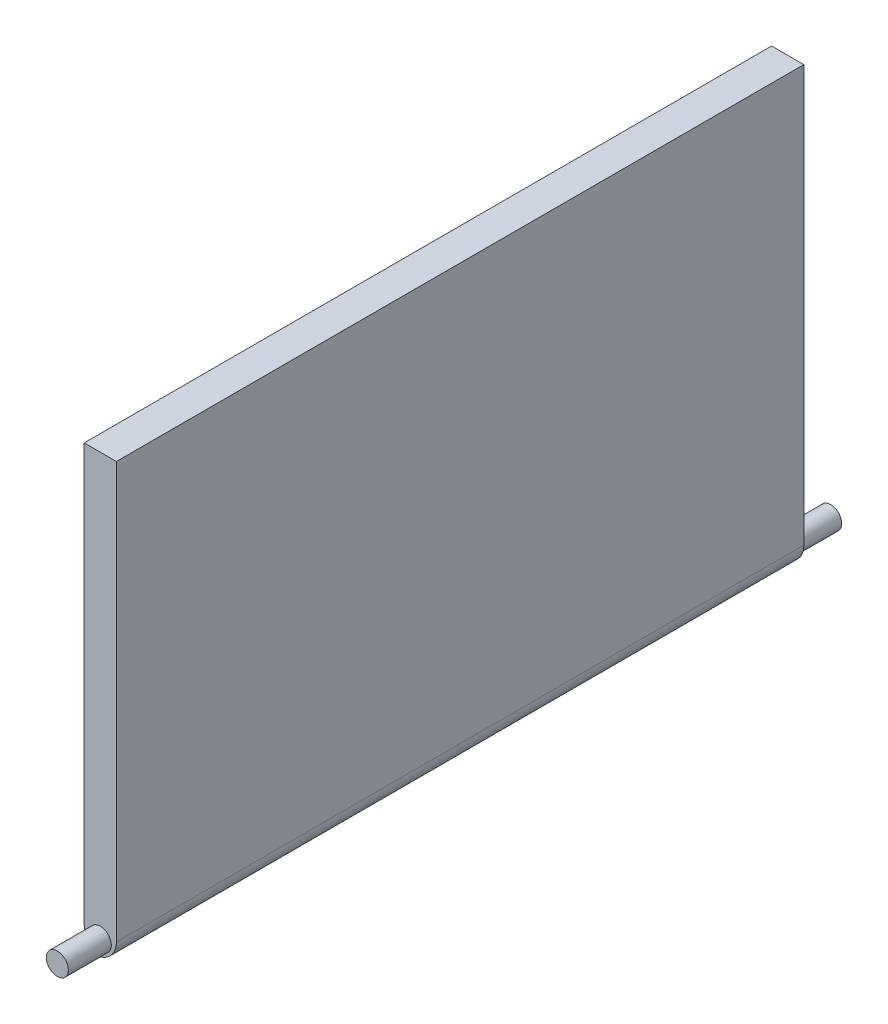
ISO-10303-21;
HEADER;
FILE_DESCRIPTION(('STEP AP214'),'2;1');
FILE_NAME('part.step','',(''),(''),'','','');
FILE_SCHEMA(('AUTOMOTIVE_DESIGN { 1 0 10303 214 1 1 1 1 }'));
ENDSEC;
DATA;
#1=APPLICATION_CONTEXT('core data for automotive mechanical design processes');
#2=APPLICATION_PROTOCOL_DEFINITION('international standard','automotive_design',2000,#1);
#3=PRODUCT_CONTEXT('',#1,'mechanical');
#4=PRODUCT('Part','Part','',(#3));
#5=PRODUCT_RELATED_PRODUCT_CATEGORY('part','',(#4));
#6=PRODUCT_DEFINITION_FORMATION('','',#4);
#7=PRODUCT_DEFINITION_CONTEXT('part definition',#1,'design');
#8=PRODUCT_DEFINITION('design','',#6,#7);
#9=PRODUCT_DEFINITION_SHAPE('','',#8);
#10=(LENGTH_UNIT() NAMED_UNIT(*) SI_UNIT(.MILLI.,.METRE.));
#11=(NAMED_UNIT(*) PLANE_ANGLE_UNIT() SI_UNIT($,.RADIAN.));
#12=(NAMED_UNIT(*) SI_UNIT($,.STERADIAN.) SOLID_ANGLE_UNIT());
#13=UNCERTAINTY_MEASURE_WITH_UNIT(LENGTH_MEASURE(1.E-05),#10,'distance_accuracy_value','');
#14=(GEOMETRIC_REPRESENTATION_CONTEXT(3) GLOBAL_UNCERTAINTY_ASSIGNED_CONTEXT((#13)) GLOBAL_UNIT_ASSIGNED_CONTEXT((#10,
#11,#12)) REPRESENTATION_CONTEXT('',''));
#15=CARTESIAN_POINT('',(0.,0.,0.));
#16=DIRECTION('',(0.,0.,1.));
#17=DIRECTION('',(1.,0.,0.));
#18=AXIS2_PLACEMENT_3D('',#15,#16,#17);
#19=CARTESIAN_POINT('',(-4.7625,59.3363559150294,-50.8));
#20=DIRECTION('',(0.,0.,-1.));
#21=DIRECTION('',(0.,1.,0.));
#22=AXIS2_PLACEMENT_3D('',#19,#20,#21);
#23=PLANE('',#22);
#24=CARTESIAN_POINT('',(-2.38125,-2.96519716723077,-50.8));
#25=DIRECTION('',(0.,0.,-1.));
#26=DIRECTION('',(0.,1.,0.));
#27=AXIS2_PLACEMENT_3D('',#24,#25,#26);
#28=CIRCLE('',#27,1.63119149715163);
#29=CARTESIAN_POINT('',(-2.38125,-1.33400567007913,-50.8));
#30=VERTEX_POINT('',#29);
#31=EDGE_CURVE('E114',#30,#30,#28,.T.);
#32=ORIENTED_EDGE('',*,*,#31,.F.);
#33=EDGE_LOOP('',(#32));
#34=FACE_BOUND('',#33,.T.);
#35=DIRECTION('',(0.,1.,0.));
#36=VECTOR('',#35,1.);
#37=CARTESIAN_POINT('',(0.,59.3363559150294,-50.8));
#38=LINE('',#37,#36);
#39=CARTESIAN_POINT('',(0.,-2.17144716723076,-50.8));
#40=VERTEX_POINT('',#39);
#41=CARTESIAN_POINT('',(0.,59.3363559150294,-50.8));
#42=VERTEX_POINT('',#41);
#43=EDGE_CURVE('E108',#40,#42,#38,.T.);
#44=ORIENTED_EDGE('',*,*,#43,.F.);
#45=CARTESIAN_POINT('',(-3.175,-2.17144716723075,-50.8));
#46=DIRECTION('',(0.,0.,-1.));
#47=DIRECTION('',(0.,1.,0.));
#48=AXIS2_PLACEMENT_3D('',#45,#46,#47);
#49=CIRCLE('',#48,3.175);
#50=CARTESIAN_POINT('',(-2.38125,-5.24562769828289,-50.8));
#51=VERTEX_POINT('',#50);
#52=EDGE_CURVE('E122',#40,#51,#49,.T.);
#53=ORIENTED_EDGE('',*,*,#52,.T.);
#54=CARTESIAN_POINT('',(-1.5875,-2.17144716723075,-50.8));
#55=DIRECTION('',(0.,0.,-1.));
#56=DIRECTION('',(0.,1.,0.));
#57=AXIS2_PLACEMENT_3D('',#54,#55,#56);
#58=CIRCLE('',#57,3.175);
#59=CARTESIAN_POINT('',(-4.7625,-2.17144716723076,-50.8));
#60=VERTEX_POINT('',#59);
#61=EDGE_CURVE('E90',#51,#60,#58,.T.);
#62=ORIENTED_EDGE('',*,*,#61,.T.);
#63=DIRECTION('',(0.,1.,0.));
#64=VECTOR('',#63,1.);
#65=CARTESIAN_POINT('',(-4.7625,59.3363559150294,-50.8));
#66=LINE('',#65,#64);
#67=CARTESIAN_POINT('',(-4.7625,59.3363559150294,-50.8));
#68=VERTEX_POINT('',#67);
#69=EDGE_CURVE('E84',#60,#68,#66,.T.);
#70=ORIENTED_EDGE('',*,*,#69,.T.);
#71=DIRECTION('',(1.,0.,0.));
#72=VECTOR('',#71,1.);
#73=CARTESIAN_POINT('',(-4.7625,59.3363559150294,-50.8));
#74=LINE('',#73,#72);
#75=EDGE_CURVE('E87',#68,#42,#74,.T.);
#76=ORIENTED_EDGE('',*,*,#75,.T.);
#77=EDGE_LOOP('',(#44,#53,#62,#70,#76));
#78=FACE_BOUND('',#77,.T.);
#79=ADVANCED_FACE('F37',(#34,#78),#23,.T.);
#80=CARTESIAN_POINT('',(-4.7625,59.3363559150294,50.8));
#81=DIRECTION('',(0.,0.,1.));
#82=DIRECTION('',(1.,0.,0.));
#83=AXIS2_PLACEMENT_3D('',#80,#81,#82);
#84=PLANE('',#83);
#85=CARTESIAN_POINT('',(-2.38125,-2.96519716723077,50.8));
#86=DIRECTION('',(0.,0.,1.));
#87=DIRECTION('',(1.,0.,0.));
#88=AXIS2_PLACEMENT_3D('',#85,#86,#87);
#89=CIRCLE('',#88,1.63119149715163);
#90=CARTESIAN_POINT('',(-0.750058502848367,-2.96519716723077,50.8));
#91=VERTEX_POINT('',#90);
#92=EDGE_CURVE('E137',#91,#91,#89,.T.);
#93=ORIENTED_EDGE('',*,*,#92,.F.);
#94=EDGE_LOOP('',(#93));
#95=FACE_BOUND('',#94,.T.);
#96=CARTESIAN_POINT('',(-1.5875,-2.17144716723077,50.8));
#97=DIRECTION('',(0.,0.,1.));
#98=DIRECTION('',(1.,0.,0.));
#99=AXIS2_PLACEMENT_3D('',#96,#97,#98);
#100=CIRCLE('',#99,3.175);
#101=CARTESIAN_POINT('',(-4.7625,-2.17144716723076,50.8));
#102=VERTEX_POINT('',#101);
#103=CARTESIAN_POINT('',(-2.38125,-5.24562769828291,50.8));
#104=VERTEX_POINT('',#103);
#105=EDGE_CURVE('E53',#102,#104,#100,.T.);
#106=ORIENTED_EDGE('',*,*,#105,.T.);
#107=CARTESIAN_POINT('',(-3.175,-2.17144716723077,50.8));
#108=DIRECTION('',(0.,0.,1.));
#109=DIRECTION('',(1.,0.,0.));
#110=AXIS2_PLACEMENT_3D('',#107,#108,#109);
#111=CIRCLE('',#110,3.175);
#112=CARTESIAN_POINT('',(0.,-2.17144716723076,50.8));
#113=VERTEX_POINT('',#112);
#114=EDGE_CURVE('E46',#104,#113,#111,.T.);
#115=ORIENTED_EDGE('',*,*,#114,.T.);
#116=DIRECTION('',(0.,-1.,0.));
#117=VECTOR('',#116,1.);
#118=CARTESIAN_POINT('',(0.,59.3363559150294,50.8));
#119=LINE('',#118,#117);
#120=CARTESIAN_POINT('',(0.,59.3363559150294,50.8));
#121=VERTEX_POINT('',#120);
#122=EDGE_CURVE('E93',#121,#113,#119,.T.);
#123=ORIENTED_EDGE('',*,*,#122,.F.);
#124=DIRECTION('',(1.,0.,0.));
#125=VECTOR('',#124,1.);
#126=CARTESIAN_POINT('',(-4.7625,59.3363559150294,50.8));
#127=LINE('',#126,#125);
#128=CARTESIAN_POINT('',(-4.7625,59.3363559150294,50.8));
#129=VERTEX_POINT('',#128);
#130=EDGE_CURVE('E100',#129,#121,#127,.T.);
#131=ORIENTED_EDGE('',*,*,#130,.F.);
#132=DIRECTION('',(0.,-1.,0.));
#133=VECTOR('',#132,1.);
#134=CARTESIAN_POINT('',(-4.7625,59.3363559150294,50.8));
#135=LINE('',#134,#133);
#136=EDGE_CURVE('E101',#129,#102,#135,.T.);
#137=ORIENTED_EDGE('',*,*,#136,.T.);
#138=EDGE_LOOP('',(#106,#115,#123,#131,#137));
#139=FACE_BOUND('',#138,.T.);
#140=ADVANCED_FACE('F127',(#95,#139),#84,.T.);
#141=CARTESIAN_POINT('',(-4.7625,59.3363559150294,-50.8));
#142=DIRECTION('',(0.,1.,0.));
#143=DIRECTION('',(0.,0.,1.));
#144=AXIS2_PLACEMENT_3D('',#141,#142,#143);
#145=PLANE('',#144);
#146=DIRECTION('',(0.,0.,1.));
#147=VECTOR('',#146,1.);
#148=CARTESIAN_POINT('',(0.,59.3363559150294,-50.8));
#149=LINE('',#148,#147);
#150=EDGE_CURVE('E99',#42,#121,#149,.T.);
#151=ORIENTED_EDGE('',*,*,#150,.F.);
#152=ORIENTED_EDGE('',*,*,#75,.F.);
#153=DIRECTION('',(0.,0.,1.));
#154=VECTOR('',#153,1.);
#155=CARTESIAN_POINT('',(-4.7625,59.3363559150294,-50.8));
#156=LINE('',#155,#154);
#157=EDGE_CURVE('E92',#68,#129,#156,.T.);
#158=ORIENTED_EDGE('',*,*,#157,.T.);
#159=ORIENTED_EDGE('',*,*,#130,.T.);
#160=EDGE_LOOP('',(#151,#152,#158,#159));
#161=FACE_BOUND('',#160,.T.);
#162=ADVANCED_FACE('F97',(#161),#145,.T.);
#163=CARTESIAN_POINT('',(-4.7625,0.,0.));
#164=DIRECTION('',(-1.,0.,0.));
#165=DIRECTION('',(0.,0.,1.));
#166=AXIS2_PLACEMENT_3D('',#163,#164,#165);
#167=PLANE('',#166);
#168=ORIENTED_EDGE('',*,*,#69,.F.);
#169=DIRECTION('',(0.,0.,-1.));
#170=VECTOR('',#169,1.);
#171=CARTESIAN_POINT('',(-4.7625,-2.17144716723076,0.));
#172=LINE('',#171,#170);
#173=EDGE_CURVE('E11',#60,#102,#172,.F.);
#174=ORIENTED_EDGE('',*,*,#173,.T.);
#175=ORIENTED_EDGE('',*,*,#136,.F.);
#176=ORIENTED_EDGE('',*,*,#157,.F.);
#177=EDGE_LOOP('',(#168,#174,#175,#176));
#178=FACE_BOUND('',#177,.T.);
#179=ADVANCED_FACE('F103',(#178),#167,.T.);
#180=CARTESIAN_POINT('',(0.,0.,0.));
#181=DIRECTION('',(-1.,0.,0.));
#182=DIRECTION('',(0.,0.,1.));
#183=AXIS2_PLACEMENT_3D('',#180,#181,#182);
#184=PLANE('',#183);
#185=ORIENTED_EDGE('',*,*,#122,.T.);
#186=DIRECTION('',(0.,0.,-1.));
#187=VECTOR('',#186,1.);
#188=CARTESIAN_POINT('',(0.,-2.17144716723075,-50.8));
#189=LINE('',#188,#187);
#190=EDGE_CURVE('E118',#113,#40,#189,.T.);
#191=ORIENTED_EDGE('',*,*,#190,.T.);
#192=ORIENTED_EDGE('',*,*,#43,.T.);
#193=ORIENTED_EDGE('',*,*,#150,.T.);
#194=EDGE_LOOP('',(#185,#191,#192,#193));
#195=FACE_BOUND('',#194,.T.);
#196=ADVANCED_FACE('F132',(#195),#184,.F.);
#197=CARTESIAN_POINT('',(-2.38125,-2.96519716723077,57.15));
#198=DIRECTION('',(0.,0.,-1.));
#199=DIRECTION('',(-1.,0.,0.));
#200=AXIS2_PLACEMENT_3D('',#197,#198,#199);
#201=CYLINDRICAL_SURFACE('',#200,1.63119149715163);
#202=CARTESIAN_POINT('',(-2.38125,-2.96519716723077,57.15));
#203=DIRECTION('',(0.,0.,1.));
#204=DIRECTION('',(1.,0.,0.));
#205=AXIS2_PLACEMENT_3D('',#202,#203,#204);
#206=CIRCLE('',#205,1.63119149715163);
#207=CARTESIAN_POINT('',(-0.750058502848367,-2.96519716723077,57.15));
#208=VERTEX_POINT('',#207);
#209=EDGE_CURVE('E110',#208,#208,#206,.T.);
#210=ORIENTED_EDGE('',*,*,#209,.F.);
#211=EDGE_LOOP('',(#210));
#212=FACE_BOUND('',#211,.T.);
#213=ORIENTED_EDGE('',*,*,#92,.T.);
#214=EDGE_LOOP('',(#213));
#215=FACE_BOUND('',#214,.T.);
#216=ADVANCED_FACE('F148',(#212,#215),#201,.T.);
#217=CARTESIAN_POINT('',(-2.38125,-2.96519716723077,57.15));
#218=DIRECTION('',(0.,0.,1.));
#219=DIRECTION('',(1.,0.,0.));
#220=AXIS2_PLACEMENT_3D('',#217,#218,#219);
#221=PLANE('',#220);
#222=ORIENTED_EDGE('',*,*,#209,.T.);
#223=EDGE_LOOP('',(#222));
#224=FACE_BOUND('',#223,.T.);
#225=ADVANCED_FACE('F146',(#224),#221,.T.);
#226=CARTESIAN_POINT('',(-2.38125,-2.96519716723077,-57.15));
#227=DIRECTION('',(0.,0.,1.));
#228=DIRECTION('',(1.,0.,0.));
#229=AXIS2_PLACEMENT_3D('',#226,#227,#228);
#230=CYLINDRICAL_SURFACE('',#229,1.63119149715163);
#231=CARTESIAN_POINT('',(-2.38125,-2.96519716723077,-57.15));
#232=DIRECTION('',(0.,0.,1.));
#233=DIRECTION('',(1.,0.,0.));
#234=AXIS2_PLACEMENT_3D('',#231,#232,#233);
#235=CIRCLE('',#234,1.63119149715163);
#236=CARTESIAN_POINT('',(-0.750058502848367,-2.96519716723077,-57.15));
#237=VERTEX_POINT('',#236);
#238=EDGE_CURVE('E135',#237,#237,#235,.T.);
#239=ORIENTED_EDGE('',*,*,#238,.T.);
#240=EDGE_LOOP('',(#239));
#241=FACE_BOUND('',#240,.T.);
#242=ORIENTED_EDGE('',*,*,#31,.T.);
#243=EDGE_LOOP('',(#242));
#244=FACE_BOUND('',#243,.T.);
#245=ADVANCED_FACE('F173',(#241,#244),#230,.T.);
#246=CARTESIAN_POINT('',(-2.38125,-2.96519716723077,-57.15));
#247=DIRECTION('',(0.,0.,-1.));
#248=DIRECTION('',(1.,0.,0.));
#249=AXIS2_PLACEMENT_3D('',#246,#247,#248);
#250=PLANE('',#249);
#251=ORIENTED_EDGE('',*,*,#238,.F.);
#252=EDGE_LOOP('',(#251));
#253=FACE_BOUND('',#252,.T.);
#254=ADVANCED_FACE('F169',(#253),#250,.T.);
#255=CARTESIAN_POINT('',(-1.5875,-2.17144716723075,-50.8));
#256=DIRECTION('',(0.,0.,-1.));
#257=DIRECTION('',(0.,1.,0.));
#258=AXIS2_PLACEMENT_3D('',#255,#256,#257);
#259=CYLINDRICAL_SURFACE('',#258,3.175);
#260=DIRECTION('',(0.,0.,-1.));
#261=VECTOR('',#260,1.);
#262=CARTESIAN_POINT('',(-2.38125,-5.2456276982829,0.));
#263=LINE('',#262,#261);
#264=EDGE_CURVE('E41',#104,#51,#263,.T.);
#265=ORIENTED_EDGE('',*,*,#264,.F.);
#266=ORIENTED_EDGE('',*,*,#105,.F.);
#267=ORIENTED_EDGE('',*,*,#173,.F.);
#268=ORIENTED_EDGE('',*,*,#61,.F.);
#269=EDGE_LOOP('',(#265,#266,#267,#268));
#270=FACE_BOUND('',#269,.T.);
#271=ADVANCED_FACE('F39',(#270),#259,.T.);
#272=CARTESIAN_POINT('',(-3.175,-2.17144716723076,0.));
#273=DIRECTION('',(0.,0.,1.));
#274=DIRECTION('',(0.,-1.,0.));
#275=AXIS2_PLACEMENT_3D('',#272,#273,#274);
#276=CYLINDRICAL_SURFACE('',#275,3.175);
#277=ORIENTED_EDGE('',*,*,#114,.F.);
#278=ORIENTED_EDGE('',*,*,#264,.T.);
#279=ORIENTED_EDGE('',*,*,#52,.F.);
#280=ORIENTED_EDGE('',*,*,#190,.F.);
#281=EDGE_LOOP('',(#277,#278,#279,#280));
#282=FACE_BOUND('',#281,.T.);
#283=ADVANCED_FACE('F133',(#282),#276,.T.);
#284=CLOSED_SHELL('',(#79,#140,#162,#179,#196,#216,#225,#245,#254,#271,#283));
#285=MANIFOLD_SOLID_BREP('B2',#284);
#286=ADVANCED_BREP_SHAPE_REPRESENTATION('',(#18,#285),#14);
#287=SHAPE_DEFINITION_REPRESENTATION(#9,#286);
ENDSEC;
END-ISO-10303-21;
